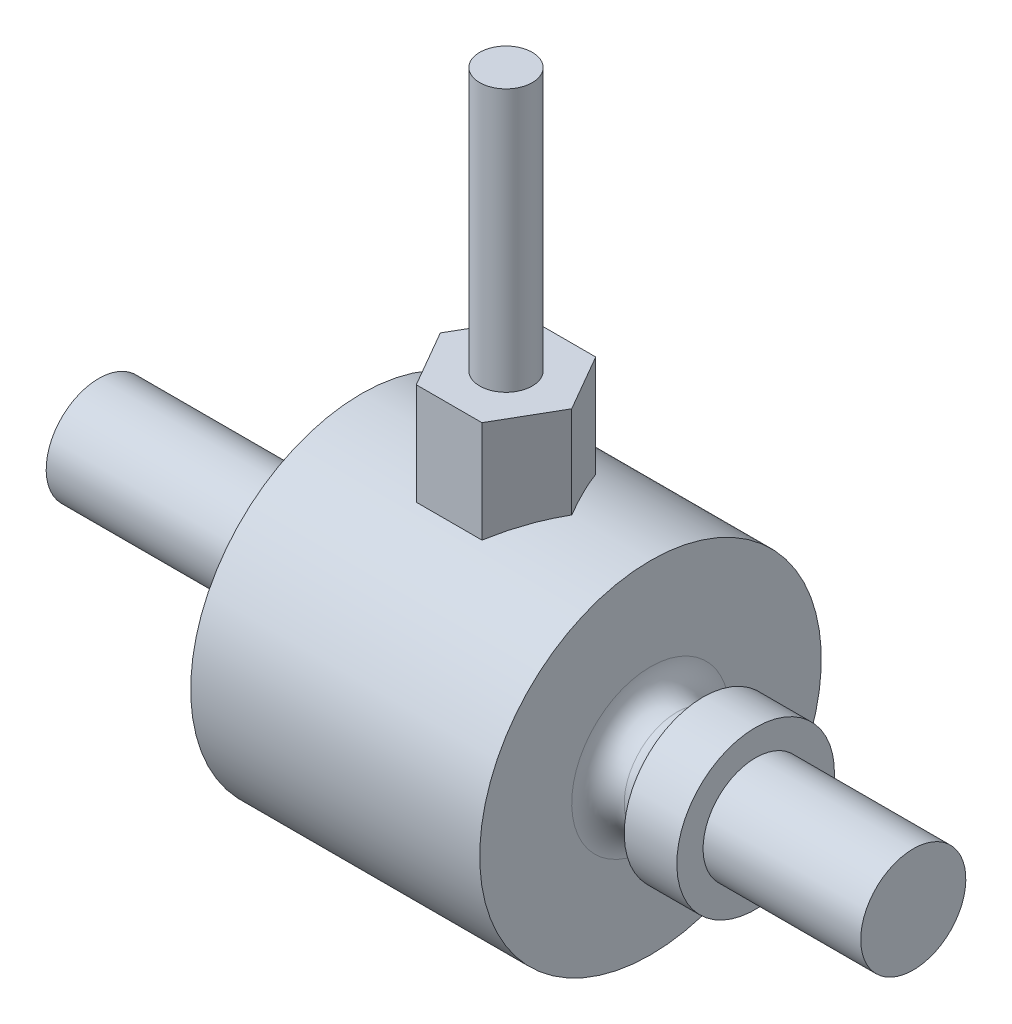
ISO-10303-21;
HEADER;
FILE_DESCRIPTION(('STEP AP214'),'2;1');
FILE_NAME('part.step','',(''),(''),'','','');
FILE_SCHEMA(('AUTOMOTIVE_DESIGN { 1 0 10303 214 1 1 1 1 }'));
ENDSEC;
DATA;
#1=APPLICATION_CONTEXT('core data for automotive mechanical design processes');
#2=APPLICATION_PROTOCOL_DEFINITION('international standard','automotive_design',2000,#1);
#3=PRODUCT_CONTEXT('',#1,'mechanical');
#4=PRODUCT('Part','Part','',(#3));
#5=PRODUCT_RELATED_PRODUCT_CATEGORY('part','',(#4));
#6=PRODUCT_DEFINITION_FORMATION('','',#4);
#7=PRODUCT_DEFINITION_CONTEXT('part definition',#1,'design');
#8=PRODUCT_DEFINITION('design','',#6,#7);
#9=PRODUCT_DEFINITION_SHAPE('','',#8);
#10=(LENGTH_UNIT() NAMED_UNIT(*) SI_UNIT(.MILLI.,.METRE.));
#11=(NAMED_UNIT(*) PLANE_ANGLE_UNIT() SI_UNIT($,.RADIAN.));
#12=(NAMED_UNIT(*) SI_UNIT($,.STERADIAN.) SOLID_ANGLE_UNIT());
#13=UNCERTAINTY_MEASURE_WITH_UNIT(LENGTH_MEASURE(1.E-05),#10,'distance_accuracy_value','');
#14=(GEOMETRIC_REPRESENTATION_CONTEXT(3) GLOBAL_UNCERTAINTY_ASSIGNED_CONTEXT((#13)) GLOBAL_UNIT_ASSIGNED_CONTEXT((#10,
#11,#12)) REPRESENTATION_CONTEXT('',''));
#15=CARTESIAN_POINT('',(0.,0.,0.));
#16=DIRECTION('',(0.,0.,1.));
#17=DIRECTION('',(1.,0.,0.));
#18=AXIS2_PLACEMENT_3D('',#15,#16,#17);
#19=CARTESIAN_POINT('',(31.,0.,0.));
#20=DIRECTION('',(1.,0.,0.));
#21=DIRECTION('',(0.,1.,0.));
#22=AXIS2_PLACEMENT_3D('',#19,#20,#21);
#23=CYLINDRICAL_SURFACE('',#22,6.5);
#24=CARTESIAN_POINT('',(10.,0.,0.));
#25=DIRECTION('',(1.,0.,0.));
#26=DIRECTION('',(0.,1.,0.));
#27=AXIS2_PLACEMENT_3D('',#24,#25,#26);
#28=CIRCLE('',#27,6.5);
#29=CARTESIAN_POINT('',(10.,6.5,0.));
#30=VERTEX_POINT('',#29);
#31=EDGE_CURVE('E134',#30,#30,#28,.T.);
#32=ORIENTED_EDGE('',*,*,#31,.T.);
#33=EDGE_LOOP('',(#32));
#34=FACE_BOUND('',#33,.T.);
#35=CARTESIAN_POINT('',(21.,0.,0.));
#36=DIRECTION('',(1.,0.,0.));
#37=DIRECTION('',(0.,1.,0.));
#38=AXIS2_PLACEMENT_3D('',#35,#36,#37);
#39=CIRCLE('',#38,6.5);
#40=CARTESIAN_POINT('',(21.,6.5,0.));
#41=VERTEX_POINT('',#40);
#42=EDGE_CURVE('E131',#41,#41,#39,.T.);
#43=ORIENTED_EDGE('',*,*,#42,.F.);
#44=EDGE_LOOP('',(#43));
#45=FACE_BOUND('',#44,.T.);
#46=DIRECTION('',(1.,0.,0.));
#47=VECTOR('',#46,1.);
#48=CARTESIAN_POINT('',(31.,6.12882533606563,-2.1650635094611));
#49=LINE('',#48,#47);
#50=CARTESIAN_POINT('',(14.25,6.12882533606563,-2.1650635094611));
#51=VERTEX_POINT('',#50);
#52=CARTESIAN_POINT('',(16.75,6.12882533606563,-2.1650635094611));
#53=VERTEX_POINT('',#52);
#54=EDGE_CURVE('E47',#51,#53,#49,.T.);
#55=ORIENTED_EDGE('',*,*,#54,.T.);
#56=CARTESIAN_POINT('',(18.,0.,0.));
#57=DIRECTION('',(-0.866025403784439,0.,0.5));
#58=DIRECTION('',(0.5,0.,0.866025403784439));
#59=AXIS2_PLACEMENT_3D('',#56,#57,#58);
#60=ELLIPSE('',#59,7.50555349946513,6.5);
#61=CARTESIAN_POINT('',(18.,6.5,0.));
#62=VERTEX_POINT('',#61);
#63=EDGE_CURVE('E11',#53,#62,#60,.F.);
#64=ORIENTED_EDGE('',*,*,#63,.T.);
#65=CARTESIAN_POINT('',(18.,0.,0.));
#66=DIRECTION('',(-0.866025403784439,0.,-0.499999999999999));
#67=DIRECTION('',(0.499999999999999,0.,-0.866025403784439));
#68=AXIS2_PLACEMENT_3D('',#65,#66,#67);
#69=ELLIPSE('',#68,7.50555349946513,6.5);
#70=CARTESIAN_POINT('',(16.75,6.12882533606563,2.16506350946109));
#71=VERTEX_POINT('',#70);
#72=EDGE_CURVE('E151',#62,#71,#69,.F.);
#73=ORIENTED_EDGE('',*,*,#72,.T.);
#74=DIRECTION('',(1.,0.,0.));
#75=VECTOR('',#74,1.);
#76=CARTESIAN_POINT('',(31.,6.12882533606563,2.16506350946109));
#77=LINE('',#76,#75);
#78=CARTESIAN_POINT('',(14.25,6.12882533606563,2.16506350946109));
#79=VERTEX_POINT('',#78);
#80=EDGE_CURVE('E155',#71,#79,#77,.F.);
#81=ORIENTED_EDGE('',*,*,#80,.T.);
#82=CARTESIAN_POINT('',(13.,0.,0.));
#83=DIRECTION('',(0.866025403784439,0.,-0.5));
#84=DIRECTION('',(0.5,0.,0.866025403784439));
#85=AXIS2_PLACEMENT_3D('',#82,#83,#84);
#86=ELLIPSE('',#85,7.50555349946513,6.5);
#87=CARTESIAN_POINT('',(13.,6.5,0.));
#88=VERTEX_POINT('',#87);
#89=EDGE_CURVE('E158',#79,#88,#86,.F.);
#90=ORIENTED_EDGE('',*,*,#89,.T.);
#91=CARTESIAN_POINT('',(13.,0.,0.));
#92=DIRECTION('',(0.866025403784439,0.,0.499999999999999));
#93=DIRECTION('',(0.499999999999999,0.,-0.866025403784439));
#94=AXIS2_PLACEMENT_3D('',#91,#92,#93);
#95=ELLIPSE('',#94,7.50555349946513,6.5);
#96=EDGE_CURVE('E161',#88,#51,#95,.F.);
#97=ORIENTED_EDGE('',*,*,#96,.T.);
#98=EDGE_LOOP('',(#55,#64,#73,#81,#90,#97));
#99=FACE_BOUND('',#98,.T.);
#100=ADVANCED_FACE('F39',(#34,#45,#99),#23,.T.);
#101=CARTESIAN_POINT('',(0.,0.,0.));
#102=DIRECTION('',(-1.,0.,0.));
#103=DIRECTION('',(0.,-1.,0.));
#104=AXIS2_PLACEMENT_3D('',#101,#102,#103);
#105=PLANE('',#104);
#106=CARTESIAN_POINT('',(0.,0.,0.));
#107=DIRECTION('',(1.,0.,0.));
#108=DIRECTION('',(0.,1.,0.));
#109=AXIS2_PLACEMENT_3D('',#106,#107,#108);
#110=CIRCLE('',#109,2.);
#111=CARTESIAN_POINT('',(0.,2.,0.));
#112=VERTEX_POINT('',#111);
#113=EDGE_CURVE('E146',#112,#112,#110,.T.);
#114=ORIENTED_EDGE('',*,*,#113,.F.);
#115=EDGE_LOOP('',(#114));
#116=FACE_BOUND('',#115,.T.);
#117=ADVANCED_FACE('F199',(#116),#105,.T.);
#118=CARTESIAN_POINT('',(31.,0.,0.));
#119=DIRECTION('',(1.,0.,0.));
#120=DIRECTION('',(0.,1.,0.));
#121=AXIS2_PLACEMENT_3D('',#118,#119,#120);
#122=CYLINDRICAL_SURFACE('',#121,2.);
#123=ORIENTED_EDGE('',*,*,#113,.T.);
#124=EDGE_LOOP('',(#123));
#125=FACE_BOUND('',#124,.T.);
#126=CARTESIAN_POINT('',(8.,0.,0.));
#127=DIRECTION('',(1.,0.,0.));
#128=DIRECTION('',(0.,1.,0.));
#129=AXIS2_PLACEMENT_3D('',#126,#127,#128);
#130=CIRCLE('',#129,2.);
#131=CARTESIAN_POINT('',(8.,2.,0.));
#132=VERTEX_POINT('',#131);
#133=EDGE_CURVE('E143',#132,#132,#130,.T.);
#134=ORIENTED_EDGE('',*,*,#133,.F.);
#135=EDGE_LOOP('',(#134));
#136=FACE_BOUND('',#135,.T.);
#137=ADVANCED_FACE('F205',(#125,#136),#122,.T.);
#138=CARTESIAN_POINT('',(8.,2.,0.));
#139=DIRECTION('',(-1.,0.,0.));
#140=DIRECTION('',(0.,-1.,0.));
#141=AXIS2_PLACEMENT_3D('',#138,#139,#140);
#142=PLANE('',#141);
#143=ORIENTED_EDGE('',*,*,#133,.T.);
#144=EDGE_LOOP('',(#143));
#145=FACE_BOUND('',#144,.T.);
#146=CARTESIAN_POINT('',(8.,0.,0.));
#147=DIRECTION('',(1.,0.,0.));
#148=DIRECTION('',(0.,1.,0.));
#149=AXIS2_PLACEMENT_3D('',#146,#147,#148);
#150=CIRCLE('',#149,3.);
#151=CARTESIAN_POINT('',(8.,3.,0.));
#152=VERTEX_POINT('',#151);
#153=EDGE_CURVE('E140',#152,#152,#150,.T.);
#154=ORIENTED_EDGE('',*,*,#153,.F.);
#155=EDGE_LOOP('',(#154));
#156=FACE_BOUND('',#155,.T.);
#157=ADVANCED_FACE('F220',(#145,#156),#142,.T.);
#158=CARTESIAN_POINT('',(31.,0.,0.));
#159=DIRECTION('',(1.,0.,0.));
#160=DIRECTION('',(0.,1.,0.));
#161=AXIS2_PLACEMENT_3D('',#158,#159,#160);
#162=CYLINDRICAL_SURFACE('',#161,3.);
#163=ORIENTED_EDGE('',*,*,#153,.T.);
#164=EDGE_LOOP('',(#163));
#165=FACE_BOUND('',#164,.T.);
#166=CARTESIAN_POINT('',(10.,0.,0.));
#167=DIRECTION('',(1.,0.,0.));
#168=DIRECTION('',(0.,1.,0.));
#169=AXIS2_PLACEMENT_3D('',#166,#167,#168);
#170=CIRCLE('',#169,3.);
#171=CARTESIAN_POINT('',(10.,3.,0.));
#172=VERTEX_POINT('',#171);
#173=EDGE_CURVE('E137',#172,#172,#170,.T.);
#174=ORIENTED_EDGE('',*,*,#173,.F.);
#175=EDGE_LOOP('',(#174));
#176=FACE_BOUND('',#175,.T.);
#177=ADVANCED_FACE('F216',(#165,#176),#162,.T.);
#178=CARTESIAN_POINT('',(10.,3.,0.));
#179=DIRECTION('',(-1.,0.,0.));
#180=DIRECTION('',(0.,-1.,0.));
#181=AXIS2_PLACEMENT_3D('',#178,#179,#180);
#182=PLANE('',#181);
#183=ORIENTED_EDGE('',*,*,#173,.T.);
#184=EDGE_LOOP('',(#183));
#185=FACE_BOUND('',#184,.T.);
#186=ORIENTED_EDGE('',*,*,#31,.F.);
#187=EDGE_LOOP('',(#186));
#188=FACE_BOUND('',#187,.T.);
#189=ADVANCED_FACE('F213',(#185,#188),#182,.T.);
#190=CARTESIAN_POINT('',(21.,6.5,0.));
#191=DIRECTION('',(1.,0.,0.));
#192=DIRECTION('',(0.,1.,0.));
#193=AXIS2_PLACEMENT_3D('',#190,#191,#192);
#194=PLANE('',#193);
#195=CARTESIAN_POINT('',(21.,0.,0.));
#196=DIRECTION('',(1.,0.,0.));
#197=DIRECTION('',(0.,1.,0.));
#198=AXIS2_PLACEMENT_3D('',#195,#196,#197);
#199=CIRCLE('',#198,3.);
#200=CARTESIAN_POINT('',(21.,3.,0.));
#201=VERTEX_POINT('',#200);
#202=EDGE_CURVE('E149',#201,#201,#199,.F.);
#203=ORIENTED_EDGE('',*,*,#202,.T.);
#204=EDGE_LOOP('',(#203));
#205=FACE_BOUND('',#204,.T.);
#206=ORIENTED_EDGE('',*,*,#42,.T.);
#207=EDGE_LOOP('',(#206));
#208=FACE_BOUND('',#207,.T.);
#209=ADVANCED_FACE('F211',(#205,#208),#194,.T.);
#210=CARTESIAN_POINT('',(31.,0.,0.));
#211=DIRECTION('',(1.,0.,0.));
#212=DIRECTION('',(0.,1.,0.));
#213=AXIS2_PLACEMENT_3D('',#210,#211,#212);
#214=CYLINDRICAL_SURFACE('',#213,3.);
#215=CARTESIAN_POINT('',(23.,0.,0.));
#216=DIRECTION('',(1.,0.,0.));
#217=DIRECTION('',(0.,1.,0.));
#218=AXIS2_PLACEMENT_3D('',#215,#216,#217);
#219=CIRCLE('',#218,3.);
#220=CARTESIAN_POINT('',(23.,3.,0.));
#221=VERTEX_POINT('',#220);
#222=EDGE_CURVE('E128',#221,#221,#219,.T.);
#223=ORIENTED_EDGE('',*,*,#222,.T.);
#224=EDGE_LOOP('',(#223));
#225=FACE_BOUND('',#224,.T.);
#226=CARTESIAN_POINT('',(25.,0.,0.));
#227=DIRECTION('',(1.,0.,0.));
#228=DIRECTION('',(0.,1.,0.));
#229=AXIS2_PLACEMENT_3D('',#226,#227,#228);
#230=CIRCLE('',#229,3.);
#231=CARTESIAN_POINT('',(25.,3.,0.));
#232=VERTEX_POINT('',#231);
#233=EDGE_CURVE('E125',#232,#232,#230,.T.);
#234=ORIENTED_EDGE('',*,*,#233,.F.);
#235=EDGE_LOOP('',(#234));
#236=FACE_BOUND('',#235,.T.);
#237=ADVANCED_FACE('F241',(#225,#236),#214,.T.);
#238=CARTESIAN_POINT('',(25.,3.,0.));
#239=DIRECTION('',(1.,0.,0.));
#240=DIRECTION('',(0.,1.,0.));
#241=AXIS2_PLACEMENT_3D('',#238,#239,#240);
#242=PLANE('',#241);
#243=ORIENTED_EDGE('',*,*,#233,.T.);
#244=EDGE_LOOP('',(#243));
#245=FACE_BOUND('',#244,.T.);
#246=CARTESIAN_POINT('',(25.,0.,0.));
#247=DIRECTION('',(1.,0.,0.));
#248=DIRECTION('',(0.,1.,0.));
#249=AXIS2_PLACEMENT_3D('',#246,#247,#248);
#250=CIRCLE('',#249,2.);
#251=CARTESIAN_POINT('',(25.,2.,0.));
#252=VERTEX_POINT('',#251);
#253=EDGE_CURVE('E122',#252,#252,#250,.T.);
#254=ORIENTED_EDGE('',*,*,#253,.F.);
#255=EDGE_LOOP('',(#254));
#256=FACE_BOUND('',#255,.T.);
#257=ADVANCED_FACE('F244',(#245,#256),#242,.T.);
#258=CARTESIAN_POINT('',(31.,0.,0.));
#259=DIRECTION('',(1.,0.,0.));
#260=DIRECTION('',(0.,1.,0.));
#261=AXIS2_PLACEMENT_3D('',#258,#259,#260);
#262=CYLINDRICAL_SURFACE('',#261,2.);
#263=ORIENTED_EDGE('',*,*,#253,.T.);
#264=EDGE_LOOP('',(#263));
#265=FACE_BOUND('',#264,.T.);
#266=CARTESIAN_POINT('',(31.,0.,0.));
#267=DIRECTION('',(1.,0.,0.));
#268=DIRECTION('',(0.,1.,0.));
#269=AXIS2_PLACEMENT_3D('',#266,#267,#268);
#270=CIRCLE('',#269,2.);
#271=CARTESIAN_POINT('',(31.,2.,0.));
#272=VERTEX_POINT('',#271);
#273=EDGE_CURVE('E114',#272,#272,#270,.T.);
#274=ORIENTED_EDGE('',*,*,#273,.F.);
#275=EDGE_LOOP('',(#274));
#276=FACE_BOUND('',#275,.T.);
#277=ADVANCED_FACE('F249',(#265,#276),#262,.T.);
#278=CARTESIAN_POINT('',(31.,2.,0.));
#279=DIRECTION('',(1.,0.,0.));
#280=DIRECTION('',(0.,1.,0.));
#281=AXIS2_PLACEMENT_3D('',#278,#279,#280);
#282=PLANE('',#281);
#283=ORIENTED_EDGE('',*,*,#273,.T.);
#284=EDGE_LOOP('',(#283));
#285=FACE_BOUND('',#284,.T.);
#286=ADVANCED_FACE('F235',(#285),#282,.T.);
#287=CARTESIAN_POINT('',(22.,0.,0.));
#288=DIRECTION('',(1.,0.,0.));
#289=DIRECTION('',(0.,1.,0.));
#290=AXIS2_PLACEMENT_3D('',#287,#288,#289);
#291=TOROIDAL_SURFACE('',#290,3.,1.);
#292=ORIENTED_EDGE('',*,*,#202,.F.);
#293=EDGE_LOOP('',(#292));
#294=FACE_BOUND('',#293,.T.);
#295=CARTESIAN_POINT('',(22.,0.,0.));
#296=DIRECTION('',(1.,0.,0.));
#297=DIRECTION('',(0.,1.,0.));
#298=AXIS2_PLACEMENT_3D('',#295,#296,#297);
#299=CIRCLE('',#298,2.);
#300=CARTESIAN_POINT('',(22.,2.,0.));
#301=VERTEX_POINT('',#300);
#302=EDGE_CURVE('E111',#301,#301,#299,.T.);
#303=ORIENTED_EDGE('',*,*,#302,.F.);
#304=EDGE_LOOP('',(#303));
#305=FACE_BOUND('',#304,.T.);
#306=ADVANCED_FACE('F41',(#294,#305),#291,.F.);
#307=CARTESIAN_POINT('',(22.,0.,0.));
#308=DIRECTION('',(-1.,0.,0.));
#309=DIRECTION('',(0.,-1.,0.));
#310=AXIS2_PLACEMENT_3D('',#307,#308,#309);
#311=TOROIDAL_SURFACE('',#310,3.,1.);
#312=ORIENTED_EDGE('',*,*,#302,.T.);
#313=EDGE_LOOP('',(#312));
#314=FACE_BOUND('',#313,.T.);
#315=ORIENTED_EDGE('',*,*,#222,.F.);
#316=EDGE_LOOP('',(#315));
#317=FACE_BOUND('',#316,.T.);
#318=ADVANCED_FACE('F227',(#314,#317),#311,.F.);
#319=CARTESIAN_POINT('',(18.,10.,0.));
#320=DIRECTION('',(-0.866025403784439,0.,0.5));
#321=DIRECTION('',(0.5,0.,0.866025403784439));
#322=AXIS2_PLACEMENT_3D('',#319,#320,#321);
#323=PLANE('',#322);
#324=ORIENTED_EDGE('',*,*,#63,.F.);
#325=DIRECTION('',(0.,-1.,0.));
#326=VECTOR('',#325,1.);
#327=CARTESIAN_POINT('',(16.75,10.,-2.1650635094611));
#328=LINE('',#327,#326);
#329=CARTESIAN_POINT('',(16.75,10.,-2.1650635094611));
#330=VERTEX_POINT('',#329);
#331=EDGE_CURVE('E95',#330,#53,#328,.T.);
#332=ORIENTED_EDGE('',*,*,#331,.F.);
#333=DIRECTION('',(-0.5,0.,-0.866025403784439));
#334=VECTOR('',#333,1.);
#335=CARTESIAN_POINT('',(18.,10.,0.));
#336=LINE('',#335,#334);
#337=CARTESIAN_POINT('',(18.,10.,0.));
#338=VERTEX_POINT('',#337);
#339=EDGE_CURVE('E102',#338,#330,#336,.T.);
#340=ORIENTED_EDGE('',*,*,#339,.F.);
#341=DIRECTION('',(0.,-1.,0.));
#342=VECTOR('',#341,1.);
#343=CARTESIAN_POINT('',(18.,10.,0.));
#344=LINE('',#343,#342);
#345=EDGE_CURVE('E176',#338,#62,#344,.T.);
#346=ORIENTED_EDGE('',*,*,#345,.T.);
#347=EDGE_LOOP('',(#324,#332,#340,#346));
#348=FACE_BOUND('',#347,.T.);
#349=ADVANCED_FACE('F110',(#348),#323,.F.);
#350=CARTESIAN_POINT('',(16.75,10.,-2.1650635094611));
#351=DIRECTION('',(0.,0.,1.));
#352=DIRECTION('',(1.,0.,0.));
#353=AXIS2_PLACEMENT_3D('',#350,#351,#352);
#354=PLANE('',#353);
#355=ORIENTED_EDGE('',*,*,#54,.F.);
#356=DIRECTION('',(0.,-1.,0.));
#357=VECTOR('',#356,1.);
#358=CARTESIAN_POINT('',(14.25,10.,-2.1650635094611));
#359=LINE('',#358,#357);
#360=CARTESIAN_POINT('',(14.25,10.,-2.1650635094611));
#361=VERTEX_POINT('',#360);
#362=EDGE_CURVE('E98',#361,#51,#359,.T.);
#363=ORIENTED_EDGE('',*,*,#362,.F.);
#364=DIRECTION('',(-1.,0.,0.));
#365=VECTOR('',#364,1.);
#366=CARTESIAN_POINT('',(16.75,10.,-2.1650635094611));
#367=LINE('',#366,#365);
#368=EDGE_CURVE('E92',#330,#361,#367,.T.);
#369=ORIENTED_EDGE('',*,*,#368,.F.);
#370=ORIENTED_EDGE('',*,*,#331,.T.);
#371=EDGE_LOOP('',(#355,#363,#369,#370));
#372=FACE_BOUND('',#371,.T.);
#373=ADVANCED_FACE('F94',(#372),#354,.F.);
#374=CARTESIAN_POINT('',(14.25,10.,-2.1650635094611));
#375=DIRECTION('',(0.866025403784439,0.,0.499999999999999));
#376=DIRECTION('',(0.499999999999999,0.,-0.866025403784439));
#377=AXIS2_PLACEMENT_3D('',#374,#375,#376);
#378=PLANE('',#377);
#379=ORIENTED_EDGE('',*,*,#96,.F.);
#380=DIRECTION('',(0.,-1.,0.));
#381=VECTOR('',#380,1.);
#382=CARTESIAN_POINT('',(13.,10.,0.));
#383=LINE('',#382,#381);
#384=CARTESIAN_POINT('',(13.,10.,0.));
#385=VERTEX_POINT('',#384);
#386=EDGE_CURVE('E116',#385,#88,#383,.T.);
#387=ORIENTED_EDGE('',*,*,#386,.F.);
#388=DIRECTION('',(-0.499999999999999,0.,0.866025403784439));
#389=VECTOR('',#388,1.);
#390=CARTESIAN_POINT('',(14.25,10.,-2.1650635094611));
#391=LINE('',#390,#389);
#392=EDGE_CURVE('E101',#361,#385,#391,.T.);
#393=ORIENTED_EDGE('',*,*,#392,.F.);
#394=ORIENTED_EDGE('',*,*,#362,.T.);
#395=EDGE_LOOP('',(#379,#387,#393,#394));
#396=FACE_BOUND('',#395,.T.);
#397=ADVANCED_FACE('F165',(#396),#378,.F.);
#398=CARTESIAN_POINT('',(13.,10.,0.));
#399=DIRECTION('',(0.866025403784439,0.,-0.5));
#400=DIRECTION('',(-0.5,0.,-0.866025403784439));
#401=AXIS2_PLACEMENT_3D('',#398,#399,#400);
#402=PLANE('',#401);
#403=ORIENTED_EDGE('',*,*,#89,.F.);
#404=DIRECTION('',(0.,-1.,0.));
#405=VECTOR('',#404,1.);
#406=CARTESIAN_POINT('',(14.25,10.,2.16506350946109));
#407=LINE('',#406,#405);
#408=CARTESIAN_POINT('',(14.25,10.,2.16506350946109));
#409=VERTEX_POINT('',#408);
#410=EDGE_CURVE('E179',#409,#79,#407,.T.);
#411=ORIENTED_EDGE('',*,*,#410,.F.);
#412=DIRECTION('',(0.499999999999999,0.,0.866025403784439));
#413=VECTOR('',#412,1.);
#414=CARTESIAN_POINT('',(13.,10.,0.));
#415=LINE('',#414,#413);
#416=EDGE_CURVE('E169',#385,#409,#415,.T.);
#417=ORIENTED_EDGE('',*,*,#416,.F.);
#418=ORIENTED_EDGE('',*,*,#386,.T.);
#419=EDGE_LOOP('',(#403,#411,#417,#418));
#420=FACE_BOUND('',#419,.T.);
#421=ADVANCED_FACE('F182',(#420),#402,.F.);
#422=CARTESIAN_POINT('',(14.25,10.,2.16506350946109));
#423=DIRECTION('',(0.,0.,-1.));
#424=DIRECTION('',(-1.,0.,0.));
#425=AXIS2_PLACEMENT_3D('',#422,#423,#424);
#426=PLANE('',#425);
#427=ORIENTED_EDGE('',*,*,#80,.F.);
#428=DIRECTION('',(0.,-1.,0.));
#429=VECTOR('',#428,1.);
#430=CARTESIAN_POINT('',(16.75,10.,2.16506350946109));
#431=LINE('',#430,#429);
#432=CARTESIAN_POINT('',(16.75,10.,2.16506350946109));
#433=VERTEX_POINT('',#432);
#434=EDGE_CURVE('E54',#433,#71,#431,.T.);
#435=ORIENTED_EDGE('',*,*,#434,.F.);
#436=DIRECTION('',(1.,0.,0.));
#437=VECTOR('',#436,1.);
#438=CARTESIAN_POINT('',(14.25,10.,2.16506350946109));
#439=LINE('',#438,#437);
#440=EDGE_CURVE('E171',#409,#433,#439,.T.);
#441=ORIENTED_EDGE('',*,*,#440,.F.);
#442=ORIENTED_EDGE('',*,*,#410,.T.);
#443=EDGE_LOOP('',(#427,#435,#441,#442));
#444=FACE_BOUND('',#443,.T.);
#445=ADVANCED_FACE('F185',(#444),#426,.F.);
#446=CARTESIAN_POINT('',(16.75,10.,2.16506350946109));
#447=DIRECTION('',(-0.866025403784439,0.,-0.499999999999999));
#448=DIRECTION('',(-0.499999999999999,0.,0.866025403784439));
#449=AXIS2_PLACEMENT_3D('',#446,#447,#448);
#450=PLANE('',#449);
#451=ORIENTED_EDGE('',*,*,#72,.F.);
#452=ORIENTED_EDGE('',*,*,#345,.F.);
#453=DIRECTION('',(0.499999999999999,0.,-0.866025403784439));
#454=VECTOR('',#453,1.);
#455=CARTESIAN_POINT('',(16.75,10.,2.16506350946109));
#456=LINE('',#455,#454);
#457=EDGE_CURVE('E106',#433,#338,#456,.T.);
#458=ORIENTED_EDGE('',*,*,#457,.F.);
#459=ORIENTED_EDGE('',*,*,#434,.T.);
#460=EDGE_LOOP('',(#451,#452,#458,#459));
#461=FACE_BOUND('',#460,.T.);
#462=ADVANCED_FACE('F187',(#461),#450,.F.);
#463=CARTESIAN_POINT('',(0.,10.,0.));
#464=DIRECTION('',(0.,1.,0.));
#465=DIRECTION('',(0.,0.,1.));
#466=AXIS2_PLACEMENT_3D('',#463,#464,#465);
#467=PLANE('',#466);
#468=CARTESIAN_POINT('',(15.5,10.,0.));
#469=DIRECTION('',(0.,1.,0.));
#470=DIRECTION('',(0.,0.,1.));
#471=AXIS2_PLACEMENT_3D('',#468,#469,#470);
#472=CIRCLE('',#471,1.);
#473=CARTESIAN_POINT('',(15.5,10.,1.));
#474=VERTEX_POINT('',#473);
#475=EDGE_CURVE('E311',#474,#474,#472,.T.);
#476=ORIENTED_EDGE('',*,*,#475,.F.);
#477=EDGE_LOOP('',(#476));
#478=FACE_BOUND('',#477,.T.);
#479=ORIENTED_EDGE('',*,*,#339,.T.);
#480=ORIENTED_EDGE('',*,*,#368,.T.);
#481=ORIENTED_EDGE('',*,*,#392,.T.);
#482=ORIENTED_EDGE('',*,*,#416,.T.);
#483=ORIENTED_EDGE('',*,*,#440,.T.);
#484=ORIENTED_EDGE('',*,*,#457,.T.);
#485=EDGE_LOOP('',(#479,#480,#481,#482,#483,#484));
#486=FACE_BOUND('',#485,.T.);
#487=ADVANCED_FACE('F105',(#478,#486),#467,.T.);
#488=CARTESIAN_POINT('',(15.5,20.,0.));
#489=DIRECTION('',(0.,-1.,0.));
#490=DIRECTION('',(0.,0.,-1.));
#491=AXIS2_PLACEMENT_3D('',#488,#489,#490);
#492=CYLINDRICAL_SURFACE('',#491,1.);
#493=CARTESIAN_POINT('',(15.5,20.,0.));
#494=DIRECTION('',(0.,1.,0.));
#495=DIRECTION('',(0.,0.,1.));
#496=AXIS2_PLACEMENT_3D('',#493,#494,#495);
#497=CIRCLE('',#496,1.);
#498=CARTESIAN_POINT('',(15.5,20.,1.));
#499=VERTEX_POINT('',#498);
#500=EDGE_CURVE('E108',#499,#499,#497,.T.);
#501=ORIENTED_EDGE('',*,*,#500,.F.);
#502=EDGE_LOOP('',(#501));
#503=FACE_BOUND('',#502,.T.);
#504=ORIENTED_EDGE('',*,*,#475,.T.);
#505=EDGE_LOOP('',(#504));
#506=FACE_BOUND('',#505,.T.);
#507=ADVANCED_FACE('F194',(#503,#506),#492,.T.);
#508=CARTESIAN_POINT('',(15.5,20.,0.));
#509=DIRECTION('',(0.,1.,0.));
#510=DIRECTION('',(0.,0.,1.));
#511=AXIS2_PLACEMENT_3D('',#508,#509,#510);
#512=PLANE('',#511);
#513=ORIENTED_EDGE('',*,*,#500,.T.);
#514=EDGE_LOOP('',(#513));
#515=FACE_BOUND('',#514,.T.);
#516=ADVANCED_FACE('F295',(#515),#512,.T.);
#517=CLOSED_SHELL('',(#100,#117,#137,#157,#177,#189,#209,#237,#257,#277,#286,#306,#318,#349,
#373,#397,#421,#445,#462,#487,#507,#516));
#518=MANIFOLD_SOLID_BREP('B2',#517);
#519=ADVANCED_BREP_SHAPE_REPRESENTATION('',(#18,#518),#14);
#520=SHAPE_DEFINITION_REPRESENTATION(#9,#519);
ENDSEC;
END-ISO-10303-21;
